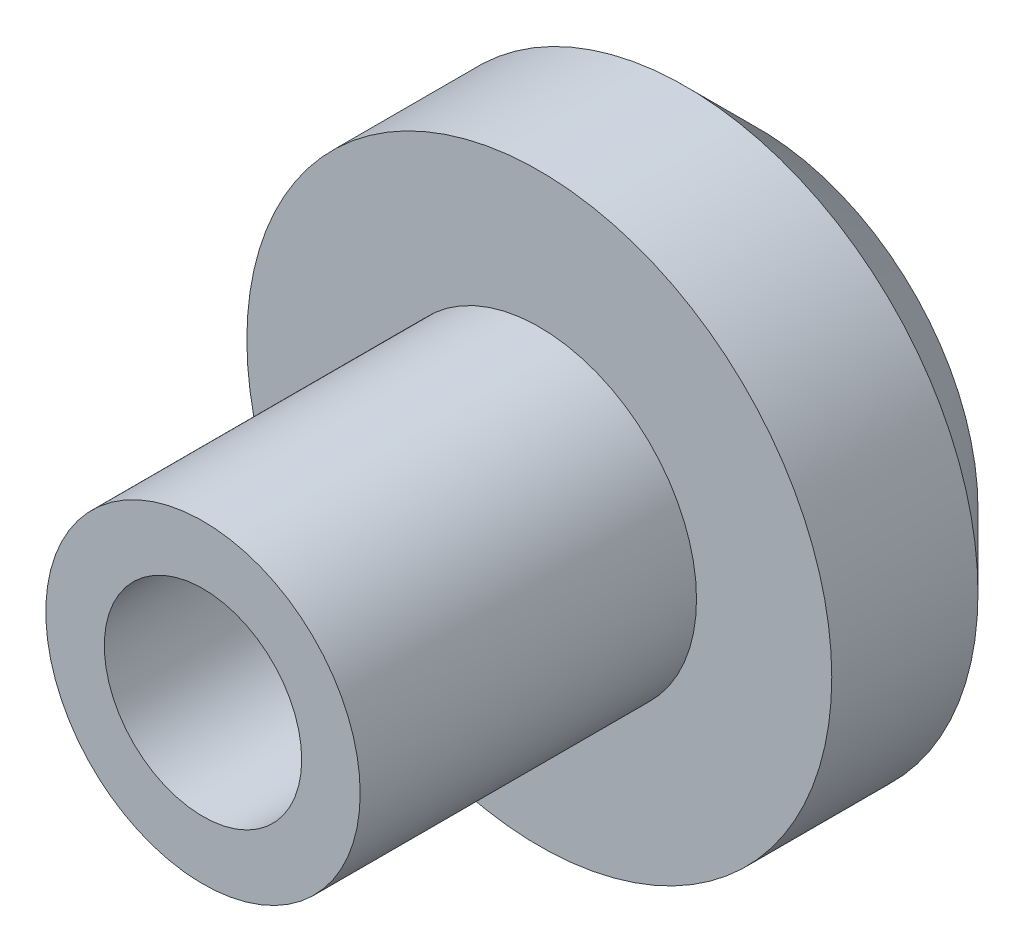
ISO-10303-21;
HEADER;
FILE_DESCRIPTION(('STEP AP214'),'2;1');
FILE_NAME('part.step','',(''),(''),'','','');
FILE_SCHEMA(('AUTOMOTIVE_DESIGN { 1 0 10303 214 1 1 1 1 }'));
ENDSEC;
DATA;
#1=APPLICATION_CONTEXT('core data for automotive mechanical design processes');
#2=APPLICATION_PROTOCOL_DEFINITION('international standard','automotive_design',2000,#1);
#3=PRODUCT_CONTEXT('',#1,'mechanical');
#4=PRODUCT('Part','Part','',(#3));
#5=PRODUCT_RELATED_PRODUCT_CATEGORY('part','',(#4));
#6=PRODUCT_DEFINITION_FORMATION('','',#4);
#7=PRODUCT_DEFINITION_CONTEXT('part definition',#1,'design');
#8=PRODUCT_DEFINITION('design','',#6,#7);
#9=PRODUCT_DEFINITION_SHAPE('','',#8);
#10=(LENGTH_UNIT() NAMED_UNIT(*) SI_UNIT(.MILLI.,.METRE.));
#11=(NAMED_UNIT(*) PLANE_ANGLE_UNIT() SI_UNIT($,.RADIAN.));
#12=(NAMED_UNIT(*) SI_UNIT($,.STERADIAN.) SOLID_ANGLE_UNIT());
#13=UNCERTAINTY_MEASURE_WITH_UNIT(LENGTH_MEASURE(1.E-05),#10,'distance_accuracy_value','');
#14=(GEOMETRIC_REPRESENTATION_CONTEXT(3) GLOBAL_UNCERTAINTY_ASSIGNED_CONTEXT((#13)) GLOBAL_UNIT_ASSIGNED_CONTEXT((#10,
#11,#12)) REPRESENTATION_CONTEXT('',''));
#15=CARTESIAN_POINT('',(0.,0.,0.));
#16=DIRECTION('',(0.,0.,1.));
#17=DIRECTION('',(1.,0.,0.));
#18=AXIS2_PLACEMENT_3D('',#15,#16,#17);
#19=CARTESIAN_POINT('',(0.,0.,3.));
#20=DIRECTION('',(0.,0.,-1.));
#21=DIRECTION('',(-1.,0.,0.));
#22=AXIS2_PLACEMENT_3D('',#19,#20,#21);
#23=CYLINDRICAL_SURFACE('',#22,4.);
#24=CARTESIAN_POINT('',(0.,0.,1.));
#25=DIRECTION('',(0.,0.,1.));
#26=DIRECTION('',(1.,0.,0.));
#27=AXIS2_PLACEMENT_3D('',#24,#25,#26);
#28=CIRCLE('',#27,4.);
#29=CARTESIAN_POINT('',(4.,0.,1.));
#30=VERTEX_POINT('',#29);
#31=EDGE_CURVE('E41',#30,#30,#28,.T.);
#32=ORIENTED_EDGE('',*,*,#31,.T.);
#33=EDGE_LOOP('',(#32));
#34=FACE_BOUND('',#33,.T.);
#35=CARTESIAN_POINT('',(0.,0.,3.));
#36=DIRECTION('',(0.,0.,1.));
#37=DIRECTION('',(1.,0.,0.));
#38=AXIS2_PLACEMENT_3D('',#35,#36,#37);
#39=CIRCLE('',#38,4.);
#40=CARTESIAN_POINT('',(4.,0.,3.));
#41=VERTEX_POINT('',#40);
#42=EDGE_CURVE('E49',#41,#41,#39,.T.);
#43=ORIENTED_EDGE('',*,*,#42,.F.);
#44=EDGE_LOOP('',(#43));
#45=FACE_BOUND('',#44,.T.);
#46=ADVANCED_FACE('F34',(#34,#45),#23,.T.);
#47=CARTESIAN_POINT('',(0.,0.,3.));
#48=DIRECTION('',(0.,0.,1.));
#49=DIRECTION('',(1.,0.,0.));
#50=AXIS2_PLACEMENT_3D('',#47,#48,#49);
#51=PLANE('',#50);
#52=CARTESIAN_POINT('',(0.,0.,3.));
#53=DIRECTION('',(0.,0.,1.));
#54=DIRECTION('',(1.,0.,0.));
#55=AXIS2_PLACEMENT_3D('',#52,#53,#54);
#56=CIRCLE('',#55,2.15);
#57=CARTESIAN_POINT('',(2.15,0.,3.));
#58=VERTEX_POINT('',#57);
#59=EDGE_CURVE('E45',#58,#58,#56,.T.);
#60=ORIENTED_EDGE('',*,*,#59,.F.);
#61=EDGE_LOOP('',(#60));
#62=FACE_BOUND('',#61,.T.);
#63=ORIENTED_EDGE('',*,*,#42,.T.);
#64=EDGE_LOOP('',(#63));
#65=FACE_BOUND('',#64,.T.);
#66=ADVANCED_FACE('F84',(#62,#65),#51,.T.);
#67=CARTESIAN_POINT('',(0.,0.,0.));
#68=DIRECTION('',(0.,0.,1.));
#69=DIRECTION('',(1.,0.,0.));
#70=AXIS2_PLACEMENT_3D('',#67,#68,#69);
#71=PLANE('',#70);
#72=CARTESIAN_POINT('',(0.,0.,0.));
#73=DIRECTION('',(0.,0.,1.));
#74=DIRECTION('',(1.,0.,0.));
#75=AXIS2_PLACEMENT_3D('',#72,#73,#74);
#76=CIRCLE('',#75,2.99999999999999);
#77=CARTESIAN_POINT('',(2.99999999999999,0.,0.));
#78=VERTEX_POINT('',#77);
#79=EDGE_CURVE('E10',#78,#78,#76,.F.);
#80=ORIENTED_EDGE('',*,*,#79,.T.);
#81=EDGE_LOOP('',(#80));
#82=FACE_BOUND('',#81,.T.);
#83=CARTESIAN_POINT('',(0.,0.,0.));
#84=DIRECTION('',(0.,0.,1.));
#85=DIRECTION('',(1.,0.,0.));
#86=AXIS2_PLACEMENT_3D('',#83,#84,#85);
#87=CIRCLE('',#86,1.35);
#88=CARTESIAN_POINT('',(1.35,0.,0.));
#89=VERTEX_POINT('',#88);
#90=EDGE_CURVE('E57',#89,#89,#87,.T.);
#91=ORIENTED_EDGE('',*,*,#90,.T.);
#92=EDGE_LOOP('',(#91));
#93=FACE_BOUND('',#92,.T.);
#94=ADVANCED_FACE('F64',(#82,#93),#71,.F.);
#95=CARTESIAN_POINT('',(0.,0.,7.6));
#96=DIRECTION('',(0.,0.,-1.));
#97=DIRECTION('',(-1.,0.,0.));
#98=AXIS2_PLACEMENT_3D('',#95,#96,#97);
#99=CYLINDRICAL_SURFACE('',#98,2.15);
#100=CARTESIAN_POINT('',(0.,0.,7.6));
#101=DIRECTION('',(0.,0.,1.));
#102=DIRECTION('',(1.,0.,0.));
#103=AXIS2_PLACEMENT_3D('',#100,#101,#102);
#104=CIRCLE('',#103,2.15);
#105=CARTESIAN_POINT('',(2.15,0.,7.6));
#106=VERTEX_POINT('',#105);
#107=EDGE_CURVE('E53',#106,#106,#104,.T.);
#108=ORIENTED_EDGE('',*,*,#107,.F.);
#109=EDGE_LOOP('',(#108));
#110=FACE_BOUND('',#109,.T.);
#111=ORIENTED_EDGE('',*,*,#59,.T.);
#112=EDGE_LOOP('',(#111));
#113=FACE_BOUND('',#112,.T.);
#114=ADVANCED_FACE('F75',(#110,#113),#99,.T.);
#115=CARTESIAN_POINT('',(0.,0.,7.6));
#116=DIRECTION('',(0.,0.,1.));
#117=DIRECTION('',(1.,0.,0.));
#118=AXIS2_PLACEMENT_3D('',#115,#116,#117);
#119=PLANE('',#118);
#120=CARTESIAN_POINT('',(0.,0.,7.6));
#121=DIRECTION('',(0.,0.,1.));
#122=DIRECTION('',(1.,0.,0.));
#123=AXIS2_PLACEMENT_3D('',#120,#121,#122);
#124=CIRCLE('',#123,1.35);
#125=CARTESIAN_POINT('',(1.35,0.,7.6));
#126=VERTEX_POINT('',#125);
#127=EDGE_CURVE('E58',#126,#126,#124,.T.);
#128=ORIENTED_EDGE('',*,*,#127,.F.);
#129=EDGE_LOOP('',(#128));
#130=FACE_BOUND('',#129,.T.);
#131=ORIENTED_EDGE('',*,*,#107,.T.);
#132=EDGE_LOOP('',(#131));
#133=FACE_BOUND('',#132,.T.);
#134=ADVANCED_FACE('F69',(#130,#133),#119,.T.);
#135=CARTESIAN_POINT('',(0.,0.,0.));
#136=DIRECTION('',(0.,0.,1.));
#137=DIRECTION('',(1.,0.,0.));
#138=AXIS2_PLACEMENT_3D('',#135,#136,#137);
#139=CYLINDRICAL_SURFACE('',#138,1.35);
#140=CARTESIAN_POINT('',(1.35,0.,0.));
#141=CARTESIAN_POINT('',(1.35,0.,0.0791666666666666));
#142=CARTESIAN_POINT('',(1.35,0.,0.158333333333333));
#143=CARTESIAN_POINT('',(1.35,0.,0.316666666666667));
#144=CARTESIAN_POINT('',(1.35,0.,0.395833333333333));
#145=CARTESIAN_POINT('',(1.35,0.,0.554166666666667));
#146=CARTESIAN_POINT('',(1.35,0.,0.633333333333333));
#147=CARTESIAN_POINT('',(1.35,0.,0.791666666666667));
#148=CARTESIAN_POINT('',(1.35,0.,0.870833333333333));
#149=CARTESIAN_POINT('',(1.35,0.,1.02916666666667));
#150=CARTESIAN_POINT('',(1.35,0.,1.10833333333333));
#151=CARTESIAN_POINT('',(1.35,0.,1.26666666666667));
#152=CARTESIAN_POINT('',(1.35,0.,1.34583333333333));
#153=CARTESIAN_POINT('',(1.35,0.,1.50416666666667));
#154=CARTESIAN_POINT('',(1.35,0.,1.58333333333333));
#155=CARTESIAN_POINT('',(1.35,0.,1.74166666666667));
#156=CARTESIAN_POINT('',(1.35,0.,1.82083333333333));
#157=CARTESIAN_POINT('',(1.35,0.,1.97916666666667));
#158=CARTESIAN_POINT('',(1.35,0.,2.05833333333333));
#159=CARTESIAN_POINT('',(1.35,0.,2.21666666666667));
#160=CARTESIAN_POINT('',(1.35,0.,2.29583333333333));
#161=CARTESIAN_POINT('',(1.35,0.,2.45416666666667));
#162=CARTESIAN_POINT('',(1.35,0.,2.53333333333333));
#163=CARTESIAN_POINT('',(1.35,0.,2.69166666666667));
#164=CARTESIAN_POINT('',(1.35,0.,2.77083333333333));
#165=CARTESIAN_POINT('',(1.35,0.,2.92916666666667));
#166=CARTESIAN_POINT('',(1.35,0.,3.00833333333333));
#167=CARTESIAN_POINT('',(1.35,0.,3.16666666666667));
#168=CARTESIAN_POINT('',(1.35,0.,3.24583333333333));
#169=CARTESIAN_POINT('',(1.35,0.,3.40416666666667));
#170=CARTESIAN_POINT('',(1.35,0.,3.48333333333333));
#171=CARTESIAN_POINT('',(1.35,0.,3.64166666666667));
#172=CARTESIAN_POINT('',(1.35,0.,3.72083333333333));
#173=CARTESIAN_POINT('',(1.35,0.,3.87916666666667));
#174=CARTESIAN_POINT('',(1.35,0.,3.95833333333333));
#175=CARTESIAN_POINT('',(1.35,0.,4.11666666666667));
#176=CARTESIAN_POINT('',(1.35,0.,4.19583333333333));
#177=CARTESIAN_POINT('',(1.35,0.,4.35416666666667));
#178=CARTESIAN_POINT('',(1.35,0.,4.43333333333333));
#179=CARTESIAN_POINT('',(1.35,0.,4.59166666666667));
#180=CARTESIAN_POINT('',(1.35,0.,4.67083333333333));
#181=CARTESIAN_POINT('',(1.35,0.,4.82916666666667));
#182=CARTESIAN_POINT('',(1.35,0.,4.90833333333333));
#183=CARTESIAN_POINT('',(1.35,0.,5.06666666666667));
#184=CARTESIAN_POINT('',(1.35,0.,5.14583333333333));
#185=CARTESIAN_POINT('',(1.35,0.,5.30416666666667));
#186=CARTESIAN_POINT('',(1.35,0.,5.38333333333333));
#187=CARTESIAN_POINT('',(1.35,0.,5.54166666666667));
#188=CARTESIAN_POINT('',(1.35,0.,5.62083333333333));
#189=CARTESIAN_POINT('',(1.35,0.,5.77916666666667));
#190=CARTESIAN_POINT('',(1.35,0.,5.85833333333333));
#191=CARTESIAN_POINT('',(1.35,0.,6.01666666666667));
#192=CARTESIAN_POINT('',(1.35,0.,6.09583333333333));
#193=CARTESIAN_POINT('',(1.35,0.,6.25416666666667));
#194=CARTESIAN_POINT('',(1.35,0.,6.33333333333333));
#195=CARTESIAN_POINT('',(1.35,0.,6.49166666666667));
#196=CARTESIAN_POINT('',(1.35,0.,6.57083333333333));
#197=CARTESIAN_POINT('',(1.35,0.,6.72916666666667));
#198=CARTESIAN_POINT('',(1.35,0.,6.80833333333333));
#199=CARTESIAN_POINT('',(1.35,0.,6.96666666666667));
#200=CARTESIAN_POINT('',(1.35,0.,7.04583333333333));
#201=CARTESIAN_POINT('',(1.35,0.,7.20416666666667));
#202=CARTESIAN_POINT('',(1.35,0.,7.28333333333333));
#203=CARTESIAN_POINT('',(1.35,0.,7.44166666666667));
#204=CARTESIAN_POINT('',(1.35,0.,7.52083333333333));
#205=CARTESIAN_POINT('',(1.35,0.,7.6));
#206=B_SPLINE_CURVE_WITH_KNOTS('',3,(#140,#141,#142,#143,#144,#145,#146,#147,#148,#149,#150,
#151,#152,#153,#154,#155,#156,#157,#158,#159,#160,#161,#162,#163,#164,#165,#166,#167,#168,#169,
#170,#171,#172,#173,#174,#175,#176,#177,#178,#179,#180,#181,#182,#183,#184,#185,#186,#187,#188,
#189,#190,#191,#192,#193,#194,#195,#196,#197,#198,#199,#200,#201,#202,#203,#204,#205),
.UNSPECIFIED.,.F.,.F.,(4,2,2,2,2,2,2,2,2,2,2,2,2,2,2,2,2,2,2,2,2,2,2,2,2,2,2,2,2,2,2,2,4),(0.,
0.2375,0.475,0.7125,0.95,1.1875,1.425,1.6625,1.9,2.1375,2.375,2.6125,2.85,3.0875,3.325,3.5625,
3.8,4.0375,4.275,4.5125,4.75,4.9875,5.225,5.4625,5.7,5.9375,6.175,6.4125,6.65,6.8875,7.125,
7.3625,7.6),.UNSPECIFIED.);
#207=EDGE_CURVE('BSEAM66',#89,#126,#206,.T.);
#208=ORIENTED_EDGE('',*,*,#90,.F.);
#209=ORIENTED_EDGE('',*,*,#127,.T.);
#210=ORIENTED_EDGE('',*,*,#207,.T.);
#211=ORIENTED_EDGE('',*,*,#207,.F.);
#212=EDGE_LOOP('',(#208,#210,#209,#211));
#213=FACE_BOUND('',#212,.T.);
#214=ADVANCED_FACE('F66',(#213),#139,.F.);
#215=CARTESIAN_POINT('',(0.,0.,1.));
#216=DIRECTION('',(0.,0.,1.));
#217=DIRECTION('',(1.,0.,0.));
#218=AXIS2_PLACEMENT_3D('',#215,#216,#217);
#219=CONICAL_SURFACE('',#218,4.,0.78539816339745);
#220=ORIENTED_EDGE('',*,*,#79,.F.);
#221=EDGE_LOOP('',(#220));
#222=FACE_BOUND('',#221,.T.);
#223=ORIENTED_EDGE('',*,*,#31,.F.);
#224=EDGE_LOOP('',(#223));
#225=FACE_BOUND('',#224,.T.);
#226=ADVANCED_FACE('F36',(#222,#225),#219,.T.);
#227=CLOSED_SHELL('',(#46,#66,#94,#114,#134,#214,#226));
#228=MANIFOLD_SOLID_BREP('B2',#227);
#229=ADVANCED_BREP_SHAPE_REPRESENTATION('',(#18,#228),#14);
#230=SHAPE_DEFINITION_REPRESENTATION(#9,#229);
ENDSEC;
END-ISO-10303-21;
